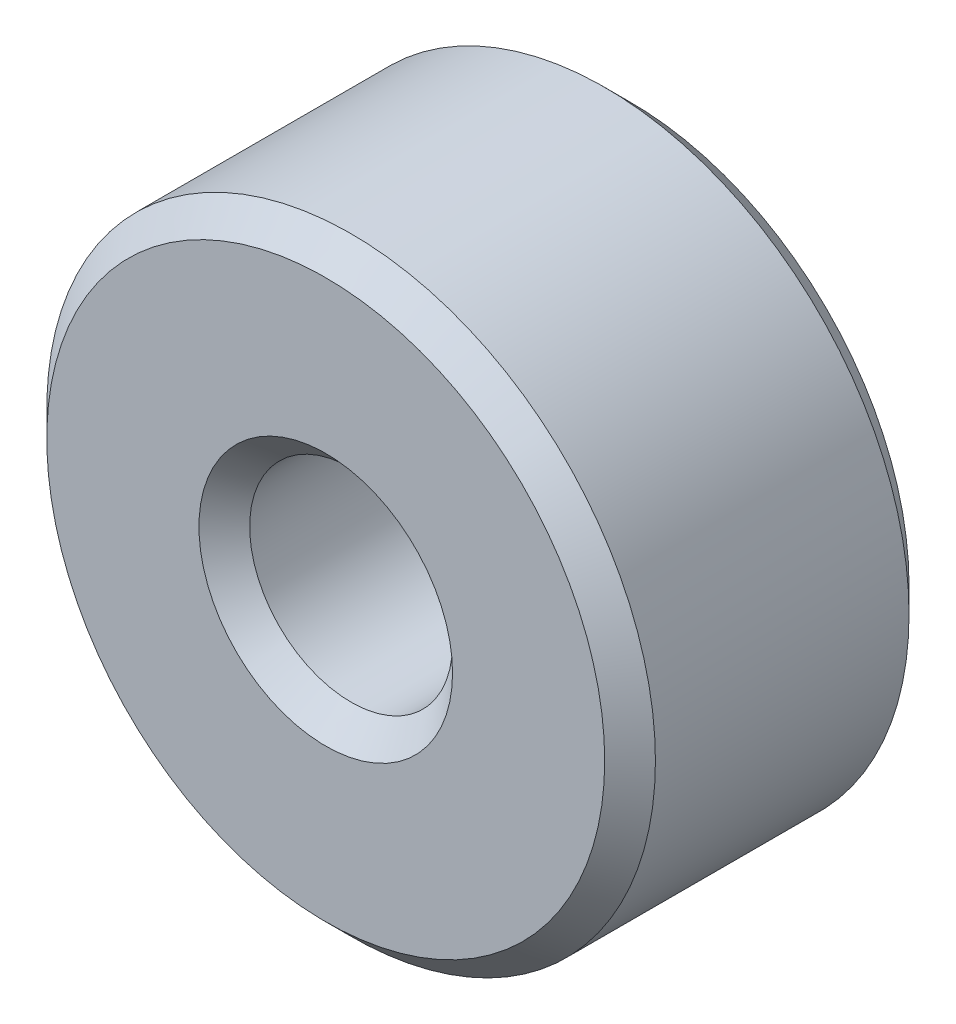
ISO-10303-21;
HEADER;
FILE_DESCRIPTION(('STEP AP214'),'2;1');
FILE_NAME('part.step','',(''),(''),'','','');
FILE_SCHEMA(('AUTOMOTIVE_DESIGN { 1 0 10303 214 1 1 1 1 }'));
ENDSEC;
DATA;
#1=APPLICATION_CONTEXT('core data for automotive mechanical design processes');
#2=APPLICATION_PROTOCOL_DEFINITION('international standard','automotive_design',2000,#1);
#3=PRODUCT_CONTEXT('',#1,'mechanical');
#4=PRODUCT('Part','Part','',(#3));
#5=PRODUCT_RELATED_PRODUCT_CATEGORY('part','',(#4));
#6=PRODUCT_DEFINITION_FORMATION('','',#4);
#7=PRODUCT_DEFINITION_CONTEXT('part definition',#1,'design');
#8=PRODUCT_DEFINITION('design','',#6,#7);
#9=PRODUCT_DEFINITION_SHAPE('','',#8);
#10=(LENGTH_UNIT() NAMED_UNIT(*) SI_UNIT(.MILLI.,.METRE.));
#11=(NAMED_UNIT(*) PLANE_ANGLE_UNIT() SI_UNIT($,.RADIAN.));
#12=(NAMED_UNIT(*) SI_UNIT($,.STERADIAN.) SOLID_ANGLE_UNIT());
#13=UNCERTAINTY_MEASURE_WITH_UNIT(LENGTH_MEASURE(1.E-05),#10,'distance_accuracy_value','');
#14=(GEOMETRIC_REPRESENTATION_CONTEXT(3) GLOBAL_UNCERTAINTY_ASSIGNED_CONTEXT((#13)) GLOBAL_UNIT_ASSIGNED_CONTEXT((#10,
#11,#12)) REPRESENTATION_CONTEXT('',''));
#15=CARTESIAN_POINT('',(0.,0.,0.));
#16=DIRECTION('',(0.,0.,1.));
#17=DIRECTION('',(1.,0.,0.));
#18=AXIS2_PLACEMENT_3D('',#15,#16,#17);
#19=CARTESIAN_POINT('',(0.,0.,2.1675));
#20=DIRECTION('',(0.,0.,1.));
#21=DIRECTION('',(1.,0.,0.));
#22=AXIS2_PLACEMENT_3D('',#19,#20,#21);
#23=PLANE('',#22);
#24=CARTESIAN_POINT('',(0.,0.,2.1675));
#25=DIRECTION('',(0.,0.,1.));
#26=DIRECTION('',(1.,0.,0.));
#27=AXIS2_PLACEMENT_3D('',#24,#25,#26);
#28=CIRCLE('',#27,0.55625);
#29=CARTESIAN_POINT('',(0.55625,0.,2.1675));
#30=VERTEX_POINT('',#29);
#31=EDGE_CURVE('E11',#30,#30,#28,.F.);
#32=ORIENTED_EDGE('',*,*,#31,.T.);
#33=EDGE_LOOP('',(#32));
#34=FACE_BOUND('',#33,.T.);
#35=CARTESIAN_POINT('',(0.,0.,2.1675));
#36=DIRECTION('',(0.,0.,1.));
#37=DIRECTION('',(1.,0.,0.));
#38=AXIS2_PLACEMENT_3D('',#35,#36,#37);
#39=CIRCLE('',#38,1.22375);
#40=CARTESIAN_POINT('',(1.22375,0.,2.1675));
#41=VERTEX_POINT('',#40);
#42=EDGE_CURVE('E47',#41,#41,#39,.T.);
#43=ORIENTED_EDGE('',*,*,#42,.T.);
#44=EDGE_LOOP('',(#43));
#45=FACE_BOUND('',#44,.T.);
#46=ADVANCED_FACE('F40',(#34,#45),#23,.T.);
#47=CARTESIAN_POINT('',(0.,0.,0.8325));
#48=DIRECTION('',(0.,0.,1.));
#49=DIRECTION('',(1.,0.,0.));
#50=AXIS2_PLACEMENT_3D('',#47,#48,#49);
#51=PLANE('',#50);
#52=CARTESIAN_POINT('',(0.,0.,0.8325));
#53=DIRECTION('',(0.,0.,1.));
#54=DIRECTION('',(1.,0.,0.));
#55=AXIS2_PLACEMENT_3D('',#52,#53,#54);
#56=CIRCLE('',#55,0.55625);
#57=CARTESIAN_POINT('',(0.55625,0.,0.8325));
#58=VERTEX_POINT('',#57);
#59=EDGE_CURVE('E66',#58,#58,#56,.T.);
#60=ORIENTED_EDGE('',*,*,#59,.T.);
#61=EDGE_LOOP('',(#60));
#62=FACE_BOUND('',#61,.T.);
#63=CARTESIAN_POINT('',(0.,0.,0.8325));
#64=DIRECTION('',(0.,0.,1.));
#65=DIRECTION('',(1.,0.,0.));
#66=AXIS2_PLACEMENT_3D('',#63,#64,#65);
#67=CIRCLE('',#66,1.22375);
#68=CARTESIAN_POINT('',(1.22375,0.,0.8325));
#69=VERTEX_POINT('',#68);
#70=EDGE_CURVE('E69',#69,#69,#67,.F.);
#71=ORIENTED_EDGE('',*,*,#70,.T.);
#72=EDGE_LOOP('',(#71));
#73=FACE_BOUND('',#72,.T.);
#74=ADVANCED_FACE('F73',(#62,#73),#51,.F.);
#75=CARTESIAN_POINT('',(0.,0.,2.1675));
#76=DIRECTION('',(0.,0.,-1.));
#77=DIRECTION('',(-1.,0.,0.));
#78=AXIS2_PLACEMENT_3D('',#75,#76,#77);
#79=CYLINDRICAL_SURFACE('',#78,1.335);
#80=CARTESIAN_POINT('',(0.,0.,0.943750000000001));
#81=DIRECTION('',(0.,0.,1.));
#82=DIRECTION('',(1.,0.,0.));
#83=AXIS2_PLACEMENT_3D('',#80,#81,#82);
#84=CIRCLE('',#83,1.335);
#85=CARTESIAN_POINT('',(1.335,0.,0.943750000000001));
#86=VERTEX_POINT('',#85);
#87=EDGE_CURVE('E51',#86,#86,#84,.T.);
#88=ORIENTED_EDGE('',*,*,#87,.T.);
#89=EDGE_LOOP('',(#88));
#90=FACE_BOUND('',#89,.T.);
#91=CARTESIAN_POINT('',(0.,0.,2.05625));
#92=DIRECTION('',(0.,0.,1.));
#93=DIRECTION('',(1.,0.,0.));
#94=AXIS2_PLACEMENT_3D('',#91,#92,#93);
#95=CIRCLE('',#94,1.335);
#96=CARTESIAN_POINT('',(1.335,0.,2.05625));
#97=VERTEX_POINT('',#96);
#98=EDGE_CURVE('E55',#97,#97,#95,.F.);
#99=ORIENTED_EDGE('',*,*,#98,.T.);
#100=EDGE_LOOP('',(#99));
#101=FACE_BOUND('',#100,.T.);
#102=ADVANCED_FACE('F83',(#90,#101),#79,.T.);
#103=CARTESIAN_POINT('',(0.,0.,2.1675));
#104=DIRECTION('',(0.,0.,-1.));
#105=DIRECTION('',(-1.,0.,0.));
#106=AXIS2_PLACEMENT_3D('',#103,#104,#105);
#107=CYLINDRICAL_SURFACE('',#106,0.445);
#108=CARTESIAN_POINT('',(0.,0.,0.943750000000001));
#109=DIRECTION('',(0.,0.,1.));
#110=DIRECTION('',(1.,0.,0.));
#111=AXIS2_PLACEMENT_3D('',#108,#109,#110);
#112=CIRCLE('',#111,0.445);
#113=CARTESIAN_POINT('',(0.445,0.,0.943750000000001));
#114=VERTEX_POINT('',#113);
#115=EDGE_CURVE('E60',#114,#114,#112,.F.);
#116=ORIENTED_EDGE('',*,*,#115,.T.);
#117=EDGE_LOOP('',(#116));
#118=FACE_BOUND('',#117,.T.);
#119=CARTESIAN_POINT('',(0.,0.,2.05625));
#120=DIRECTION('',(0.,0.,1.));
#121=DIRECTION('',(1.,0.,0.));
#122=AXIS2_PLACEMENT_3D('',#119,#120,#121);
#123=CIRCLE('',#122,0.445);
#124=CARTESIAN_POINT('',(0.445,0.,2.05625));
#125=VERTEX_POINT('',#124);
#126=EDGE_CURVE('E63',#125,#125,#123,.T.);
#127=ORIENTED_EDGE('',*,*,#126,.T.);
#128=EDGE_LOOP('',(#127));
#129=FACE_BOUND('',#128,.T.);
#130=ADVANCED_FACE('F86',(#118,#129),#107,.F.);
#131=CARTESIAN_POINT('',(0.,0.,0.8325));
#132=DIRECTION('',(0.,0.,-1.));
#133=DIRECTION('',(-1.,0.,0.));
#134=AXIS2_PLACEMENT_3D('',#131,#132,#133);
#135=CONICAL_SURFACE('',#134,0.55625,0.785398163397446);
#136=ORIENTED_EDGE('',*,*,#115,.F.);
#137=EDGE_LOOP('',(#136));
#138=FACE_BOUND('',#137,.T.);
#139=ORIENTED_EDGE('',*,*,#59,.F.);
#140=EDGE_LOOP('',(#139));
#141=FACE_BOUND('',#140,.T.);
#142=ADVANCED_FACE('F79',(#138,#141),#135,.F.);
#143=CARTESIAN_POINT('',(0.,0.,0.943750000000001));
#144=DIRECTION('',(0.,0.,1.));
#145=DIRECTION('',(1.,0.,0.));
#146=AXIS2_PLACEMENT_3D('',#143,#144,#145);
#147=CONICAL_SURFACE('',#146,1.335,0.78539816339745);
#148=ORIENTED_EDGE('',*,*,#70,.F.);
#149=EDGE_LOOP('',(#148));
#150=FACE_BOUND('',#149,.T.);
#151=ORIENTED_EDGE('',*,*,#87,.F.);
#152=EDGE_LOOP('',(#151));
#153=FACE_BOUND('',#152,.T.);
#154=ADVANCED_FACE('F75',(#150,#153),#147,.T.);
#155=CARTESIAN_POINT('',(0.,0.,2.05625));
#156=DIRECTION('',(0.,0.,1.));
#157=DIRECTION('',(1.,0.,0.));
#158=AXIS2_PLACEMENT_3D('',#155,#156,#157);
#159=CONICAL_SURFACE('',#158,0.445,0.78539816339745);
#160=ORIENTED_EDGE('',*,*,#31,.F.);
#161=EDGE_LOOP('',(#160));
#162=FACE_BOUND('',#161,.T.);
#163=ORIENTED_EDGE('',*,*,#126,.F.);
#164=EDGE_LOOP('',(#163));
#165=FACE_BOUND('',#164,.T.);
#166=ADVANCED_FACE('F78',(#162,#165),#159,.F.);
#167=CARTESIAN_POINT('',(0.,0.,2.1675));
#168=DIRECTION('',(0.,0.,-1.));
#169=DIRECTION('',(-1.,0.,0.));
#170=AXIS2_PLACEMENT_3D('',#167,#168,#169);
#171=CONICAL_SURFACE('',#170,1.22375,0.785398163397447);
#172=ORIENTED_EDGE('',*,*,#98,.F.);
#173=EDGE_LOOP('',(#172));
#174=FACE_BOUND('',#173,.T.);
#175=ORIENTED_EDGE('',*,*,#42,.F.);
#176=EDGE_LOOP('',(#175));
#177=FACE_BOUND('',#176,.T.);
#178=ADVANCED_FACE('F42',(#174,#177),#171,.T.);
#179=CLOSED_SHELL('',(#46,#74,#102,#130,#142,#154,#166,#178));
#180=MANIFOLD_SOLID_BREP('B2',#179);
#181=ADVANCED_BREP_SHAPE_REPRESENTATION('',(#18,#180),#14);
#182=SHAPE_DEFINITION_REPRESENTATION(#9,#181);
ENDSEC;
END-ISO-10303-21;
